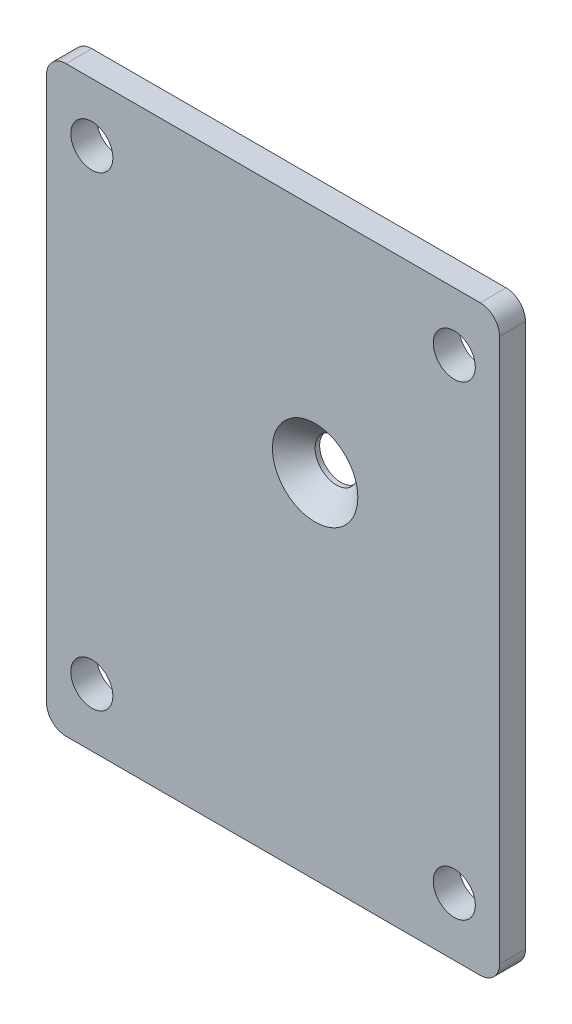
ISO-10303-21;
HEADER;
FILE_DESCRIPTION(('STEP AP214'),'2;1');
FILE_NAME('part.step','',(''),(''),'','','');
FILE_SCHEMA(('AUTOMOTIVE_DESIGN { 1 0 10303 214 1 1 1 1 }'));
ENDSEC;
DATA;
#1=APPLICATION_CONTEXT('core data for automotive mechanical design processes');
#2=APPLICATION_PROTOCOL_DEFINITION('international standard','automotive_design',2000,#1);
#3=PRODUCT_CONTEXT('',#1,'mechanical');
#4=PRODUCT('Part','Part','',(#3));
#5=PRODUCT_RELATED_PRODUCT_CATEGORY('part','',(#4));
#6=PRODUCT_DEFINITION_FORMATION('','',#4);
#7=PRODUCT_DEFINITION_CONTEXT('part definition',#1,'design');
#8=PRODUCT_DEFINITION('design','',#6,#7);
#9=PRODUCT_DEFINITION_SHAPE('','',#8);
#10=(LENGTH_UNIT() NAMED_UNIT(*) SI_UNIT(.MILLI.,.METRE.));
#11=(NAMED_UNIT(*) PLANE_ANGLE_UNIT() SI_UNIT($,.RADIAN.));
#12=(NAMED_UNIT(*) SI_UNIT($,.STERADIAN.) SOLID_ANGLE_UNIT());
#13=UNCERTAINTY_MEASURE_WITH_UNIT(LENGTH_MEASURE(1.E-05),#10,'distance_accuracy_value','');
#14=(GEOMETRIC_REPRESENTATION_CONTEXT(3) GLOBAL_UNCERTAINTY_ASSIGNED_CONTEXT((#13)) GLOBAL_UNIT_ASSIGNED_CONTEXT((#10,
#11,#12)) REPRESENTATION_CONTEXT('',''));
#15=CARTESIAN_POINT('',(0.,0.,0.));
#16=DIRECTION('',(0.,0.,1.));
#17=DIRECTION('',(1.,0.,0.));
#18=AXIS2_PLACEMENT_3D('',#15,#16,#17);
#19=CARTESIAN_POINT('',(0.,0.,20.5));
#20=DIRECTION('',(0.,0.,1.));
#21=DIRECTION('',(1.,0.,0.));
#22=AXIS2_PLACEMENT_3D('',#19,#20,#21);
#23=PLANE('',#22);
#24=CARTESIAN_POINT('',(6.5,9.5,20.5));
#25=DIRECTION('',(0.,0.,1.));
#26=DIRECTION('',(1.,0.,0.));
#27=AXIS2_PLACEMENT_3D('',#24,#25,#26);
#28=CIRCLE('',#27,6.6);
#29=CARTESIAN_POINT('',(13.1,9.5,20.5));
#30=VERTEX_POINT('',#29);
#31=EDGE_CURVE('E190',#30,#30,#28,.T.);
#32=ORIENTED_EDGE('',*,*,#31,.F.);
#33=EDGE_LOOP('',(#32));
#34=FACE_BOUND('',#33,.T.);
#35=CARTESIAN_POINT('',(-28.,36.,20.5));
#36=DIRECTION('',(0.,0.,1.));
#37=DIRECTION('',(1.,0.,0.));
#38=AXIS2_PLACEMENT_3D('',#35,#36,#37);
#39=CIRCLE('',#38,3.25);
#40=CARTESIAN_POINT('',(-24.75,36.,20.5));
#41=VERTEX_POINT('',#40);
#42=EDGE_CURVE('E182',#41,#41,#39,.T.);
#43=ORIENTED_EDGE('',*,*,#42,.F.);
#44=EDGE_LOOP('',(#43));
#45=FACE_BOUND('',#44,.T.);
#46=CARTESIAN_POINT('',(28.,36.,20.5));
#47=DIRECTION('',(0.,0.,1.));
#48=DIRECTION('',(1.,0.,0.));
#49=AXIS2_PLACEMENT_3D('',#46,#47,#48);
#50=CIRCLE('',#49,3.25);
#51=CARTESIAN_POINT('',(31.25,36.,20.5));
#52=VERTEX_POINT('',#51);
#53=EDGE_CURVE('E199',#52,#52,#50,.T.);
#54=ORIENTED_EDGE('',*,*,#53,.F.);
#55=EDGE_LOOP('',(#54));
#56=FACE_BOUND('',#55,.T.);
#57=CARTESIAN_POINT('',(28.,-36.,20.5));
#58=DIRECTION('',(0.,0.,1.));
#59=DIRECTION('',(1.,0.,0.));
#60=AXIS2_PLACEMENT_3D('',#57,#58,#59);
#61=CIRCLE('',#60,3.25);
#62=CARTESIAN_POINT('',(31.25,-36.,20.5));
#63=VERTEX_POINT('',#62);
#64=EDGE_CURVE('E205',#63,#63,#61,.T.);
#65=ORIENTED_EDGE('',*,*,#64,.F.);
#66=EDGE_LOOP('',(#65));
#67=FACE_BOUND('',#66,.T.);
#68=CARTESIAN_POINT('',(-28.,-36.,20.5));
#69=DIRECTION('',(0.,0.,1.));
#70=DIRECTION('',(1.,0.,0.));
#71=AXIS2_PLACEMENT_3D('',#68,#69,#70);
#72=CIRCLE('',#71,3.25);
#73=CARTESIAN_POINT('',(-24.75,-36.,20.5));
#74=VERTEX_POINT('',#73);
#75=EDGE_CURVE('E211',#74,#74,#72,.T.);
#76=ORIENTED_EDGE('',*,*,#75,.F.);
#77=EDGE_LOOP('',(#76));
#78=FACE_BOUND('',#77,.T.);
#79=DIRECTION('',(1.,0.,0.));
#80=VECTOR('',#79,1.);
#81=CARTESIAN_POINT('',(-35.,-45.,20.5));
#82=LINE('',#81,#80);
#83=CARTESIAN_POINT('',(-32.,-45.,20.5));
#84=VERTEX_POINT('',#83);
#85=CARTESIAN_POINT('',(32.,-45.,20.5));
#86=VERTEX_POINT('',#85);
#87=EDGE_CURVE('E174',#84,#86,#82,.T.);
#88=ORIENTED_EDGE('',*,*,#87,.T.);
#89=CARTESIAN_POINT('',(32.,-42.,20.5));
#90=DIRECTION('',(0.,0.,1.));
#91=DIRECTION('',(1.,0.,0.));
#92=AXIS2_PLACEMENT_3D('',#89,#90,#91);
#93=CIRCLE('',#92,3.);
#94=CARTESIAN_POINT('',(35.,-42.,20.5));
#95=VERTEX_POINT('',#94);
#96=EDGE_CURVE('E136',#86,#95,#93,.T.);
#97=ORIENTED_EDGE('',*,*,#96,.T.);
#98=DIRECTION('',(0.,1.,0.));
#99=VECTOR('',#98,1.);
#100=CARTESIAN_POINT('',(35.,-45.,20.5));
#101=LINE('',#100,#99);
#102=CARTESIAN_POINT('',(35.,42.,20.5));
#103=VERTEX_POINT('',#102);
#104=EDGE_CURVE('E172',#95,#103,#101,.T.);
#105=ORIENTED_EDGE('',*,*,#104,.T.);
#106=CARTESIAN_POINT('',(32.,42.,20.5));
#107=DIRECTION('',(0.,0.,1.));
#108=DIRECTION('',(1.,0.,0.));
#109=AXIS2_PLACEMENT_3D('',#106,#107,#108);
#110=CIRCLE('',#109,3.);
#111=CARTESIAN_POINT('',(32.,45.,20.5));
#112=VERTEX_POINT('',#111);
#113=EDGE_CURVE('E139',#103,#112,#110,.T.);
#114=ORIENTED_EDGE('',*,*,#113,.T.);
#115=DIRECTION('',(-1.,0.,0.));
#116=VECTOR('',#115,1.);
#117=CARTESIAN_POINT('',(-35.,45.,20.5));
#118=LINE('',#117,#116);
#119=CARTESIAN_POINT('',(-32.,45.,20.5));
#120=VERTEX_POINT('',#119);
#121=EDGE_CURVE('E165',#112,#120,#118,.T.);
#122=ORIENTED_EDGE('',*,*,#121,.T.);
#123=CARTESIAN_POINT('',(-32.,42.,20.5));
#124=DIRECTION('',(0.,0.,1.));
#125=DIRECTION('',(1.,0.,0.));
#126=AXIS2_PLACEMENT_3D('',#123,#124,#125);
#127=CIRCLE('',#126,3.);
#128=CARTESIAN_POINT('',(-35.,42.,20.5));
#129=VERTEX_POINT('',#128);
#130=EDGE_CURVE('E137',#120,#129,#127,.T.);
#131=ORIENTED_EDGE('',*,*,#130,.T.);
#132=DIRECTION('',(0.,-1.,0.));
#133=VECTOR('',#132,1.);
#134=CARTESIAN_POINT('',(-35.,-45.,20.5));
#135=LINE('',#134,#133);
#136=CARTESIAN_POINT('',(-35.,-42.,20.5));
#137=VERTEX_POINT('',#136);
#138=EDGE_CURVE('E171',#129,#137,#135,.T.);
#139=ORIENTED_EDGE('',*,*,#138,.T.);
#140=CARTESIAN_POINT('',(-32.,-42.,20.5));
#141=DIRECTION('',(0.,0.,1.));
#142=DIRECTION('',(1.,0.,0.));
#143=AXIS2_PLACEMENT_3D('',#140,#141,#142);
#144=CIRCLE('',#143,3.);
#145=EDGE_CURVE('E146',#137,#84,#144,.T.);
#146=ORIENTED_EDGE('',*,*,#145,.T.);
#147=EDGE_LOOP('',(#88,#97,#105,#114,#122,#131,#139,#146));
#148=FACE_BOUND('',#147,.T.);
#149=ADVANCED_FACE('F47',(#34,#45,#56,#67,#78,#148),#23,.T.);
#150=CARTESIAN_POINT('',(0.,0.,16.5));
#151=DIRECTION('',(0.,0.,1.));
#152=DIRECTION('',(1.,0.,0.));
#153=AXIS2_PLACEMENT_3D('',#150,#151,#152);
#154=PLANE('',#153);
#155=CARTESIAN_POINT('',(6.5,9.5,16.5));
#156=DIRECTION('',(0.,0.,1.));
#157=DIRECTION('',(1.,0.,0.));
#158=AXIS2_PLACEMENT_3D('',#155,#156,#157);
#159=CIRCLE('',#158,3.3);
#160=CARTESIAN_POINT('',(9.8,9.5,16.5));
#161=VERTEX_POINT('',#160);
#162=EDGE_CURVE('E180',#161,#161,#159,.T.);
#163=ORIENTED_EDGE('',*,*,#162,.T.);
#164=EDGE_LOOP('',(#163));
#165=FACE_BOUND('',#164,.T.);
#166=CARTESIAN_POINT('',(-28.,36.,16.5));
#167=DIRECTION('',(0.,0.,1.));
#168=DIRECTION('',(1.,0.,0.));
#169=AXIS2_PLACEMENT_3D('',#166,#167,#168);
#170=CIRCLE('',#169,3.25);
#171=CARTESIAN_POINT('',(-24.75,36.,16.5));
#172=VERTEX_POINT('',#171);
#173=EDGE_CURVE('E187',#172,#172,#170,.T.);
#174=ORIENTED_EDGE('',*,*,#173,.T.);
#175=EDGE_LOOP('',(#174));
#176=FACE_BOUND('',#175,.T.);
#177=CARTESIAN_POINT('',(28.,36.,16.5));
#178=DIRECTION('',(0.,0.,1.));
#179=DIRECTION('',(1.,0.,0.));
#180=AXIS2_PLACEMENT_3D('',#177,#178,#179);
#181=CIRCLE('',#180,3.25);
#182=CARTESIAN_POINT('',(31.25,36.,16.5));
#183=VERTEX_POINT('',#182);
#184=EDGE_CURVE('E202',#183,#183,#181,.T.);
#185=ORIENTED_EDGE('',*,*,#184,.T.);
#186=EDGE_LOOP('',(#185));
#187=FACE_BOUND('',#186,.T.);
#188=CARTESIAN_POINT('',(28.,-36.,16.5));
#189=DIRECTION('',(0.,0.,1.));
#190=DIRECTION('',(1.,0.,0.));
#191=AXIS2_PLACEMENT_3D('',#188,#189,#190);
#192=CIRCLE('',#191,3.25);
#193=CARTESIAN_POINT('',(31.25,-36.,16.5));
#194=VERTEX_POINT('',#193);
#195=EDGE_CURVE('E208',#194,#194,#192,.T.);
#196=ORIENTED_EDGE('',*,*,#195,.T.);
#197=EDGE_LOOP('',(#196));
#198=FACE_BOUND('',#197,.T.);
#199=CARTESIAN_POINT('',(-28.,-36.,16.5));
#200=DIRECTION('',(0.,0.,1.));
#201=DIRECTION('',(1.,0.,0.));
#202=AXIS2_PLACEMENT_3D('',#199,#200,#201);
#203=CIRCLE('',#202,3.25);
#204=CARTESIAN_POINT('',(-24.75,-36.,16.5));
#205=VERTEX_POINT('',#204);
#206=EDGE_CURVE('E176',#205,#205,#203,.T.);
#207=ORIENTED_EDGE('',*,*,#206,.T.);
#208=EDGE_LOOP('',(#207));
#209=FACE_BOUND('',#208,.T.);
#210=DIRECTION('',(0.,-1.,0.));
#211=VECTOR('',#210,1.);
#212=CARTESIAN_POINT('',(35.,-45.,16.5));
#213=LINE('',#212,#211);
#214=CARTESIAN_POINT('',(35.,42.,16.5));
#215=VERTEX_POINT('',#214);
#216=CARTESIAN_POINT('',(35.,-42.,16.5));
#217=VERTEX_POINT('',#216);
#218=EDGE_CURVE('E118',#215,#217,#213,.T.);
#219=ORIENTED_EDGE('',*,*,#218,.T.);
#220=CARTESIAN_POINT('',(32.,-42.,16.5));
#221=DIRECTION('',(0.,0.,1.));
#222=DIRECTION('',(1.,0.,0.));
#223=AXIS2_PLACEMENT_3D('',#220,#221,#222);
#224=CIRCLE('',#223,3.);
#225=CARTESIAN_POINT('',(32.,-45.,16.5));
#226=VERTEX_POINT('',#225);
#227=EDGE_CURVE('E112',#217,#226,#224,.F.);
#228=ORIENTED_EDGE('',*,*,#227,.T.);
#229=DIRECTION('',(-1.,0.,0.));
#230=VECTOR('',#229,1.);
#231=CARTESIAN_POINT('',(-35.,-45.,16.5));
#232=LINE('',#231,#230);
#233=CARTESIAN_POINT('',(-32.,-45.,16.5));
#234=VERTEX_POINT('',#233);
#235=EDGE_CURVE('E115',#226,#234,#232,.T.);
#236=ORIENTED_EDGE('',*,*,#235,.T.);
#237=CARTESIAN_POINT('',(-32.,-42.,16.5));
#238=DIRECTION('',(0.,0.,1.));
#239=DIRECTION('',(1.,0.,0.));
#240=AXIS2_PLACEMENT_3D('',#237,#238,#239);
#241=CIRCLE('',#240,3.);
#242=CARTESIAN_POINT('',(-35.,-42.,16.5));
#243=VERTEX_POINT('',#242);
#244=EDGE_CURVE('E123',#234,#243,#241,.F.);
#245=ORIENTED_EDGE('',*,*,#244,.T.);
#246=DIRECTION('',(0.,1.,0.));
#247=VECTOR('',#246,1.);
#248=CARTESIAN_POINT('',(-35.,-45.,16.5));
#249=LINE('',#248,#247);
#250=CARTESIAN_POINT('',(-35.,42.,16.5));
#251=VERTEX_POINT('',#250);
#252=EDGE_CURVE('E133',#243,#251,#249,.T.);
#253=ORIENTED_EDGE('',*,*,#252,.T.);
#254=CARTESIAN_POINT('',(-32.,42.,16.5));
#255=DIRECTION('',(0.,0.,1.));
#256=DIRECTION('',(1.,0.,0.));
#257=AXIS2_PLACEMENT_3D('',#254,#255,#256);
#258=CIRCLE('',#257,3.);
#259=CARTESIAN_POINT('',(-32.,45.,16.5));
#260=VERTEX_POINT('',#259);
#261=EDGE_CURVE('E67',#251,#260,#258,.F.);
#262=ORIENTED_EDGE('',*,*,#261,.T.);
#263=DIRECTION('',(1.,0.,0.));
#264=VECTOR('',#263,1.);
#265=CARTESIAN_POINT('',(-35.,45.,16.5));
#266=LINE('',#265,#264);
#267=CARTESIAN_POINT('',(32.,45.,16.5));
#268=VERTEX_POINT('',#267);
#269=EDGE_CURVE('E141',#260,#268,#266,.T.);
#270=ORIENTED_EDGE('',*,*,#269,.T.);
#271=CARTESIAN_POINT('',(32.,42.,16.5));
#272=DIRECTION('',(0.,0.,1.));
#273=DIRECTION('',(1.,0.,0.));
#274=AXIS2_PLACEMENT_3D('',#271,#272,#273);
#275=CIRCLE('',#274,3.);
#276=EDGE_CURVE('E155',#268,#215,#275,.F.);
#277=ORIENTED_EDGE('',*,*,#276,.T.);
#278=EDGE_LOOP('',(#219,#228,#236,#245,#253,#262,#270,#277));
#279=FACE_BOUND('',#278,.T.);
#280=ADVANCED_FACE('F114',(#165,#176,#187,#198,#209,#279),#154,.F.);
#281=CARTESIAN_POINT('',(-35.,45.,-97.5175425099138));
#282=DIRECTION('',(0.,1.,0.));
#283=DIRECTION('',(0.,0.,1.));
#284=AXIS2_PLACEMENT_3D('',#281,#282,#283);
#285=PLANE('',#284);
#286=ORIENTED_EDGE('',*,*,#121,.F.);
#287=DIRECTION('',(0.,0.,1.));
#288=VECTOR('',#287,1.);
#289=CARTESIAN_POINT('',(32.,45.,-97.5175425099138));
#290=LINE('',#289,#288);
#291=EDGE_CURVE('E11',#112,#268,#290,.F.);
#292=ORIENTED_EDGE('',*,*,#291,.T.);
#293=ORIENTED_EDGE('',*,*,#269,.F.);
#294=DIRECTION('',(0.,0.,1.));
#295=VECTOR('',#294,1.);
#296=CARTESIAN_POINT('',(-32.,45.,-97.5175425099138));
#297=LINE('',#296,#295);
#298=EDGE_CURVE('E55',#260,#120,#297,.T.);
#299=ORIENTED_EDGE('',*,*,#298,.T.);
#300=EDGE_LOOP('',(#286,#292,#293,#299));
#301=FACE_BOUND('',#300,.T.);
#302=ADVANCED_FACE('F164',(#301),#285,.T.);
#303=CARTESIAN_POINT('',(-35.,-45.,-97.5175425099138));
#304=DIRECTION('',(-1.,0.,0.));
#305=DIRECTION('',(0.,0.,1.));
#306=AXIS2_PLACEMENT_3D('',#303,#304,#305);
#307=PLANE('',#306);
#308=ORIENTED_EDGE('',*,*,#252,.F.);
#309=DIRECTION('',(0.,0.,1.));
#310=VECTOR('',#309,1.);
#311=CARTESIAN_POINT('',(-35.,-42.,-97.5175425099138));
#312=LINE('',#311,#310);
#313=EDGE_CURVE('E159',#243,#137,#312,.T.);
#314=ORIENTED_EDGE('',*,*,#313,.T.);
#315=ORIENTED_EDGE('',*,*,#138,.F.);
#316=DIRECTION('',(0.,0.,1.));
#317=VECTOR('',#316,1.);
#318=CARTESIAN_POINT('',(-35.,42.,-97.5175425099138));
#319=LINE('',#318,#317);
#320=EDGE_CURVE('E122',#129,#251,#319,.F.);
#321=ORIENTED_EDGE('',*,*,#320,.T.);
#322=EDGE_LOOP('',(#308,#314,#315,#321));
#323=FACE_BOUND('',#322,.T.);
#324=ADVANCED_FACE('F221',(#323),#307,.T.);
#325=CARTESIAN_POINT('',(-35.,-45.,-97.5175425099138));
#326=DIRECTION('',(0.,-1.,0.));
#327=DIRECTION('',(0.,0.,-1.));
#328=AXIS2_PLACEMENT_3D('',#325,#326,#327);
#329=PLANE('',#328);
#330=ORIENTED_EDGE('',*,*,#235,.F.);
#331=DIRECTION('',(0.,0.,1.));
#332=VECTOR('',#331,1.);
#333=CARTESIAN_POINT('',(32.,-45.,-97.5175425099138));
#334=LINE('',#333,#332);
#335=EDGE_CURVE('E129',#226,#86,#334,.T.);
#336=ORIENTED_EDGE('',*,*,#335,.T.);
#337=ORIENTED_EDGE('',*,*,#87,.F.);
#338=DIRECTION('',(0.,0.,1.));
#339=VECTOR('',#338,1.);
#340=CARTESIAN_POINT('',(-32.,-45.,-97.5175425099138));
#341=LINE('',#340,#339);
#342=EDGE_CURVE('E132',#84,#234,#341,.F.);
#343=ORIENTED_EDGE('',*,*,#342,.T.);
#344=EDGE_LOOP('',(#330,#336,#337,#343));
#345=FACE_BOUND('',#344,.T.);
#346=ADVANCED_FACE('F127',(#345),#329,.T.);
#347=CARTESIAN_POINT('',(35.,-45.,-97.5175425099138));
#348=DIRECTION('',(1.,0.,0.));
#349=DIRECTION('',(0.,0.,-1.));
#350=AXIS2_PLACEMENT_3D('',#347,#348,#349);
#351=PLANE('',#350);
#352=ORIENTED_EDGE('',*,*,#104,.F.);
#353=DIRECTION('',(0.,0.,1.));
#354=VECTOR('',#353,1.);
#355=CARTESIAN_POINT('',(35.,-42.,-97.5175425099138));
#356=LINE('',#355,#354);
#357=EDGE_CURVE('E152',#95,#217,#356,.F.);
#358=ORIENTED_EDGE('',*,*,#357,.T.);
#359=ORIENTED_EDGE('',*,*,#218,.F.);
#360=DIRECTION('',(0.,0.,1.));
#361=VECTOR('',#360,1.);
#362=CARTESIAN_POINT('',(35.,42.,-97.5175425099138));
#363=LINE('',#362,#361);
#364=EDGE_CURVE('E149',#215,#103,#363,.T.);
#365=ORIENTED_EDGE('',*,*,#364,.T.);
#366=EDGE_LOOP('',(#352,#358,#359,#365));
#367=FACE_BOUND('',#366,.T.);
#368=ADVANCED_FACE('F246',(#367),#351,.T.);
#369=CARTESIAN_POINT('',(-28.,-36.,20.5));
#370=DIRECTION('',(0.,0.,1.));
#371=DIRECTION('',(1.,0.,0.));
#372=AXIS2_PLACEMENT_3D('',#369,#370,#371);
#373=CYLINDRICAL_SURFACE('',#372,3.25);
#374=ORIENTED_EDGE('',*,*,#206,.F.);
#375=EDGE_LOOP('',(#374));
#376=FACE_BOUND('',#375,.T.);
#377=ORIENTED_EDGE('',*,*,#75,.T.);
#378=EDGE_LOOP('',(#377));
#379=FACE_BOUND('',#378,.T.);
#380=ADVANCED_FACE('F249',(#376,#379),#373,.F.);
#381=CARTESIAN_POINT('',(28.,-36.,20.5));
#382=DIRECTION('',(0.,0.,1.));
#383=DIRECTION('',(1.,0.,0.));
#384=AXIS2_PLACEMENT_3D('',#381,#382,#383);
#385=CYLINDRICAL_SURFACE('',#384,3.25);
#386=ORIENTED_EDGE('',*,*,#195,.F.);
#387=EDGE_LOOP('',(#386));
#388=FACE_BOUND('',#387,.T.);
#389=ORIENTED_EDGE('',*,*,#64,.T.);
#390=EDGE_LOOP('',(#389));
#391=FACE_BOUND('',#390,.T.);
#392=ADVANCED_FACE('F259',(#388,#391),#385,.F.);
#393=CARTESIAN_POINT('',(28.,36.,20.5));
#394=DIRECTION('',(0.,0.,1.));
#395=DIRECTION('',(1.,0.,0.));
#396=AXIS2_PLACEMENT_3D('',#393,#394,#395);
#397=CYLINDRICAL_SURFACE('',#396,3.25);
#398=ORIENTED_EDGE('',*,*,#184,.F.);
#399=EDGE_LOOP('',(#398));
#400=FACE_BOUND('',#399,.T.);
#401=ORIENTED_EDGE('',*,*,#53,.T.);
#402=EDGE_LOOP('',(#401));
#403=FACE_BOUND('',#402,.T.);
#404=ADVANCED_FACE('F263',(#400,#403),#397,.F.);
#405=CARTESIAN_POINT('',(-28.,36.,20.5));
#406=DIRECTION('',(0.,0.,1.));
#407=DIRECTION('',(1.,0.,0.));
#408=AXIS2_PLACEMENT_3D('',#405,#406,#407);
#409=CYLINDRICAL_SURFACE('',#408,3.25);
#410=ORIENTED_EDGE('',*,*,#173,.F.);
#411=EDGE_LOOP('',(#410));
#412=FACE_BOUND('',#411,.T.);
#413=ORIENTED_EDGE('',*,*,#42,.T.);
#414=EDGE_LOOP('',(#413));
#415=FACE_BOUND('',#414,.T.);
#416=ADVANCED_FACE('F267',(#412,#415),#409,.F.);
#417=CARTESIAN_POINT('',(6.5,9.5,20.5));
#418=DIRECTION('',(0.,0.,1.));
#419=DIRECTION('',(1.,0.,0.));
#420=AXIS2_PLACEMENT_3D('',#417,#418,#419);
#421=CYLINDRICAL_SURFACE('',#420,3.3);
#422=CARTESIAN_POINT('',(6.5,9.5,17.2));
#423=DIRECTION('',(0.,0.,1.));
#424=DIRECTION('',(1.,0.,0.));
#425=AXIS2_PLACEMENT_3D('',#422,#423,#424);
#426=CIRCLE('',#425,3.3);
#427=CARTESIAN_POINT('',(9.8,9.5,17.2));
#428=VERTEX_POINT('',#427);
#429=EDGE_CURVE('E183',#428,#428,#426,.T.);
#430=ORIENTED_EDGE('',*,*,#429,.T.);
#431=EDGE_LOOP('',(#430));
#432=FACE_BOUND('',#431,.T.);
#433=ORIENTED_EDGE('',*,*,#162,.F.);
#434=EDGE_LOOP('',(#433));
#435=FACE_BOUND('',#434,.T.);
#436=ADVANCED_FACE('F271',(#432,#435),#421,.F.);
#437=CARTESIAN_POINT('',(6.5,9.5,20.5));
#438=DIRECTION('',(0.,0.,1.));
#439=DIRECTION('',(1.,0.,0.));
#440=AXIS2_PLACEMENT_3D('',#437,#438,#439);
#441=CONICAL_SURFACE('',#440,6.6,0.785398163397449);
#442=ORIENTED_EDGE('',*,*,#429,.F.);
#443=EDGE_LOOP('',(#442));
#444=FACE_BOUND('',#443,.T.);
#445=ORIENTED_EDGE('',*,*,#31,.T.);
#446=EDGE_LOOP('',(#445));
#447=FACE_BOUND('',#446,.T.);
#448=ADVANCED_FACE('F232',(#444,#447),#441,.F.);
#449=CARTESIAN_POINT('',(32.,-42.,-97.5175425099138));
#450=DIRECTION('',(0.,0.,1.));
#451=DIRECTION('',(1.,0.,0.));
#452=AXIS2_PLACEMENT_3D('',#449,#450,#451);
#453=CYLINDRICAL_SURFACE('',#452,3.);
#454=ORIENTED_EDGE('',*,*,#227,.F.);
#455=ORIENTED_EDGE('',*,*,#357,.F.);
#456=ORIENTED_EDGE('',*,*,#96,.F.);
#457=ORIENTED_EDGE('',*,*,#335,.F.);
#458=EDGE_LOOP('',(#454,#455,#456,#457));
#459=FACE_BOUND('',#458,.T.);
#460=ADVANCED_FACE('F135',(#459),#453,.T.);
#461=CARTESIAN_POINT('',(-32.,-42.,-97.5175425099138));
#462=DIRECTION('',(0.,0.,1.));
#463=DIRECTION('',(1.,0.,0.));
#464=AXIS2_PLACEMENT_3D('',#461,#462,#463);
#465=CYLINDRICAL_SURFACE('',#464,3.);
#466=ORIENTED_EDGE('',*,*,#244,.F.);
#467=ORIENTED_EDGE('',*,*,#342,.F.);
#468=ORIENTED_EDGE('',*,*,#145,.F.);
#469=ORIENTED_EDGE('',*,*,#313,.F.);
#470=EDGE_LOOP('',(#466,#467,#468,#469));
#471=FACE_BOUND('',#470,.T.);
#472=ADVANCED_FACE('F223',(#471),#465,.T.);
#473=CARTESIAN_POINT('',(32.,42.,-97.5175425099138));
#474=DIRECTION('',(0.,0.,1.));
#475=DIRECTION('',(1.,0.,0.));
#476=AXIS2_PLACEMENT_3D('',#473,#474,#475);
#477=CYLINDRICAL_SURFACE('',#476,3.);
#478=ORIENTED_EDGE('',*,*,#276,.F.);
#479=ORIENTED_EDGE('',*,*,#291,.F.);
#480=ORIENTED_EDGE('',*,*,#113,.F.);
#481=ORIENTED_EDGE('',*,*,#364,.F.);
#482=EDGE_LOOP('',(#478,#479,#480,#481));
#483=FACE_BOUND('',#482,.T.);
#484=ADVANCED_FACE('F225',(#483),#477,.T.);
#485=CARTESIAN_POINT('',(-32.,42.,-97.5175425099138));
#486=DIRECTION('',(0.,0.,1.));
#487=DIRECTION('',(1.,0.,0.));
#488=AXIS2_PLACEMENT_3D('',#485,#486,#487);
#489=CYLINDRICAL_SURFACE('',#488,3.);
#490=ORIENTED_EDGE('',*,*,#261,.F.);
#491=ORIENTED_EDGE('',*,*,#320,.F.);
#492=ORIENTED_EDGE('',*,*,#130,.F.);
#493=ORIENTED_EDGE('',*,*,#298,.F.);
#494=EDGE_LOOP('',(#490,#491,#492,#493));
#495=FACE_BOUND('',#494,.T.);
#496=ADVANCED_FACE('F49',(#495),#489,.T.);
#497=CLOSED_SHELL('',(#149,#280,#302,#324,#346,#368,#380,#392,#404,#416,#436,#448,#460,#472,
#484,#496));
#498=MANIFOLD_SOLID_BREP('B2',#497);
#499=ADVANCED_BREP_SHAPE_REPRESENTATION('',(#18,#498),#14);
#500=SHAPE_DEFINITION_REPRESENTATION(#9,#499);
ENDSEC;
END-ISO-10303-21;
